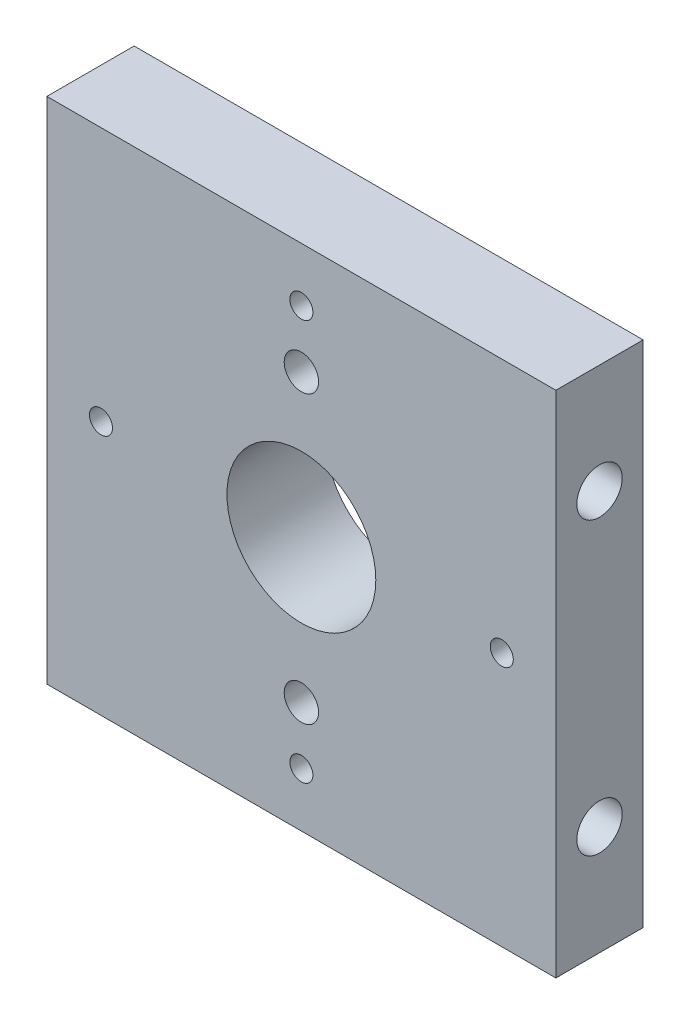
ISO-10303-21;
HEADER;
FILE_DESCRIPTION(('STEP AP214'),'2;1');
FILE_NAME('part.step','',(''),(''),'','','');
FILE_SCHEMA(('AUTOMOTIVE_DESIGN { 1 0 10303 214 1 1 1 1 }'));
ENDSEC;
DATA;
#1=APPLICATION_CONTEXT('core data for automotive mechanical design processes');
#2=APPLICATION_PROTOCOL_DEFINITION('international standard','automotive_design',2000,#1);
#3=PRODUCT_CONTEXT('',#1,'mechanical');
#4=PRODUCT('Part','Part','',(#3));
#5=PRODUCT_RELATED_PRODUCT_CATEGORY('part','',(#4));
#6=PRODUCT_DEFINITION_FORMATION('','',#4);
#7=PRODUCT_DEFINITION_CONTEXT('part definition',#1,'design');
#8=PRODUCT_DEFINITION('design','',#6,#7);
#9=PRODUCT_DEFINITION_SHAPE('','',#8);
#10=(LENGTH_UNIT() NAMED_UNIT(*) SI_UNIT(.MILLI.,.METRE.));
#11=(NAMED_UNIT(*) PLANE_ANGLE_UNIT() SI_UNIT($,.RADIAN.));
#12=(NAMED_UNIT(*) SI_UNIT($,.STERADIAN.) SOLID_ANGLE_UNIT());
#13=UNCERTAINTY_MEASURE_WITH_UNIT(LENGTH_MEASURE(1.E-05),#10,'distance_accuracy_value','');
#14=(GEOMETRIC_REPRESENTATION_CONTEXT(3) GLOBAL_UNCERTAINTY_ASSIGNED_CONTEXT((#13)) GLOBAL_UNIT_ASSIGNED_CONTEXT((#10,
#11,#12)) REPRESENTATION_CONTEXT('',''));
#15=CARTESIAN_POINT('',(0.,0.,0.));
#16=DIRECTION('',(0.,0.,1.));
#17=DIRECTION('',(1.,0.,0.));
#18=AXIS2_PLACEMENT_3D('',#15,#16,#17);
#19=CARTESIAN_POINT('',(12.2250000011377,12.7,0.));
#20=DIRECTION('',(1.,0.,0.));
#21=DIRECTION('',(0.,1.,0.));
#22=AXIS2_PLACEMENT_3D('',#19,#20,#21);
#23=CONICAL_SURFACE('',#22,1.98099999926171,1.02974425747177);
#24=CARTESIAN_POINT('',(11.0346951121016,12.7,-5.6843418860808E-11));
#25=VERTEX_POINT('',#24);
#26=VERTEX_LOOP('',#25);
#27=FACE_BOUND('',#26,.T.);
#28=CARTESIAN_POINT('',(12.225,12.7,0.));
#29=DIRECTION('',(-1.,0.,0.));
#30=DIRECTION('',(0.,0.,1.));
#31=AXIS2_PLACEMENT_3D('',#28,#29,#30);
#32=CIRCLE('',#31,1.981);
#33=CARTESIAN_POINT('',(12.225,12.7,1.981));
#34=VERTEX_POINT('',#33);
#35=EDGE_CURVE('E149',#34,#34,#32,.F.);
#36=ORIENTED_EDGE('',*,*,#35,.T.);
#37=EDGE_LOOP('',(#36));
#38=FACE_BOUND('',#37,.T.);
#39=ADVANCED_FACE('F17',(#27,#38),#23,.F.);
#40=CARTESIAN_POINT('',(12.225,-12.7,0.));
#41=DIRECTION('',(1.,0.,0.));
#42=DIRECTION('',(0.,1.,0.));
#43=AXIS2_PLACEMENT_3D('',#40,#41,#42);
#44=CONICAL_SURFACE('',#43,1.981,1.02974425867666);
#45=CARTESIAN_POINT('',(11.0346951137064,-12.7,0.));
#46=VERTEX_POINT('',#45);
#47=VERTEX_LOOP('',#46);
#48=FACE_BOUND('',#47,.T.);
#49=CARTESIAN_POINT('',(12.225,-12.7,0.));
#50=DIRECTION('',(1.,0.,0.));
#51=DIRECTION('',(0.,1.,0.));
#52=AXIS2_PLACEMENT_3D('',#49,#50,#51);
#53=CIRCLE('',#52,1.981);
#54=CARTESIAN_POINT('',(12.225,-10.719,0.));
#55=VERTEX_POINT('',#54);
#56=EDGE_CURVE('E146',#55,#55,#53,.T.);
#57=ORIENTED_EDGE('',*,*,#56,.T.);
#58=EDGE_LOOP('',(#57));
#59=FACE_BOUND('',#58,.T.);
#60=ADVANCED_FACE('F326',(#48,#59),#44,.F.);
#61=CARTESIAN_POINT('',(-12.225,12.7,0.));
#62=DIRECTION('',(-1.,0.,0.));
#63=DIRECTION('',(0.,-1.,0.));
#64=AXIS2_PLACEMENT_3D('',#61,#62,#63);
#65=CONICAL_SURFACE('',#64,1.981,1.02974425867666);
#66=CARTESIAN_POINT('',(-11.0346951137064,12.7,0.));
#67=VERTEX_POINT('',#66);
#68=VERTEX_LOOP('',#67);
#69=FACE_BOUND('',#68,.T.);
#70=CARTESIAN_POINT('',(-12.225,12.7,0.));
#71=DIRECTION('',(-1.,0.,0.));
#72=DIRECTION('',(0.,-1.,0.));
#73=AXIS2_PLACEMENT_3D('',#70,#71,#72);
#74=CIRCLE('',#73,1.981);
#75=CARTESIAN_POINT('',(-12.225,10.719,0.));
#76=VERTEX_POINT('',#75);
#77=EDGE_CURVE('E143',#76,#76,#74,.T.);
#78=ORIENTED_EDGE('',*,*,#77,.T.);
#79=EDGE_LOOP('',(#78));
#80=FACE_BOUND('',#79,.T.);
#81=ADVANCED_FACE('F322',(#69,#80),#65,.F.);
#82=CARTESIAN_POINT('',(-12.2250000011377,-12.7,0.));
#83=DIRECTION('',(-1.,0.,0.));
#84=DIRECTION('',(0.,-1.,0.));
#85=AXIS2_PLACEMENT_3D('',#82,#83,#84);
#86=CONICAL_SURFACE('',#85,1.98099999926171,1.02974425747177);
#87=CARTESIAN_POINT('',(-11.0346951121016,-12.7,-5.6843418860808E-11));
#88=VERTEX_POINT('',#87);
#89=VERTEX_LOOP('',#88);
#90=FACE_BOUND('',#89,.T.);
#91=CARTESIAN_POINT('',(-12.225,-12.7,0.));
#92=DIRECTION('',(1.,0.,0.));
#93=DIRECTION('',(0.,0.,-1.));
#94=AXIS2_PLACEMENT_3D('',#91,#92,#93);
#95=CIRCLE('',#94,1.981);
#96=CARTESIAN_POINT('',(-12.225,-12.7,-1.981));
#97=VERTEX_POINT('',#96);
#98=EDGE_CURVE('E106',#97,#97,#95,.F.);
#99=ORIENTED_EDGE('',*,*,#98,.T.);
#100=EDGE_LOOP('',(#99));
#101=FACE_BOUND('',#100,.T.);
#102=ADVANCED_FACE('F325',(#90,#101),#86,.F.);
#103=CARTESIAN_POINT('',(0.,0.,-3.81));
#104=DIRECTION('',(0.,0.,-1.));
#105=DIRECTION('',(-1.,0.,0.));
#106=AXIS2_PLACEMENT_3D('',#103,#104,#105);
#107=CYLINDRICAL_SURFACE('',#106,15.);
#108=DIRECTION('',(0.,0.,1.));
#109=VECTOR('',#108,1.);
#110=CARTESIAN_POINT('',(-1.11636438495681,-14.9584,-2.05999999999999));
#111=LINE('',#110,#109);
#112=CARTESIAN_POINT('',(-1.11636438495682,-14.9584,-4.80999999999998));
#113=VERTEX_POINT('',#112);
#114=CARTESIAN_POINT('',(-1.11636438495683,-14.9584,-3.80999999999997));
#115=VERTEX_POINT('',#114);
#116=EDGE_CURVE('E132',#113,#115,#111,.T.);
#117=ORIENTED_EDGE('',*,*,#116,.T.);
#118=CARTESIAN_POINT('',(0.,0.,-3.81));
#119=DIRECTION('',(0.,0.,-1.));
#120=DIRECTION('',(-1.,0.,0.));
#121=AXIS2_PLACEMENT_3D('',#118,#119,#120);
#122=CIRCLE('',#121,15.);
#123=CARTESIAN_POINT('',(-1.11636438495686,14.9584,-3.80999999999998));
#124=VERTEX_POINT('',#123);
#125=EDGE_CURVE('E120',#115,#124,#122,.T.);
#126=ORIENTED_EDGE('',*,*,#125,.T.);
#127=DIRECTION('',(0.,0.,-1.));
#128=VECTOR('',#127,1.);
#129=CARTESIAN_POINT('',(-1.11636438495683,14.9584,-2.05999999999999));
#130=LINE('',#129,#128);
#131=CARTESIAN_POINT('',(-1.11636438495683,14.9584,-4.80999999999998));
#132=VERTEX_POINT('',#131);
#133=EDGE_CURVE('E114',#124,#132,#130,.T.);
#134=ORIENTED_EDGE('',*,*,#133,.T.);
#135=CARTESIAN_POINT('',(0.,0.,-4.80999999999999));
#136=DIRECTION('',(0.,0.,-1.));
#137=DIRECTION('',(-1.,0.,0.));
#138=AXIS2_PLACEMENT_3D('',#135,#136,#137);
#139=CIRCLE('',#138,15.);
#140=EDGE_CURVE('E127',#132,#113,#139,.F.);
#141=ORIENTED_EDGE('',*,*,#140,.T.);
#142=EDGE_LOOP('',(#117,#126,#134,#141));
#143=FACE_BOUND('',#142,.T.);
#144=ADVANCED_FACE('F206',(#143),#107,.T.);
#145=CARTESIAN_POINT('',(0.,-12.5,-4.80999999999996));
#146=DIRECTION('',(0.,0.,1.));
#147=DIRECTION('',(1.,0.,0.));
#148=AXIS2_PLACEMENT_3D('',#145,#146,#147);
#149=CYLINDRICAL_SURFACE('',#148,2.69999999999999);
#150=CARTESIAN_POINT('',(0.,-12.5,0.690000000000008));
#151=DIRECTION('',(0.,0.,1.));
#152=DIRECTION('',(1.,0.,0.));
#153=AXIS2_PLACEMENT_3D('',#150,#151,#152);
#154=CIRCLE('',#153,2.69999999999999);
#155=CARTESIAN_POINT('',(2.69999999999999,-12.5,0.690000000000009));
#156=VERTEX_POINT('',#155);
#157=EDGE_CURVE('E123',#156,#156,#154,.T.);
#158=ORIENTED_EDGE('',*,*,#157,.T.);
#159=EDGE_LOOP('',(#158));
#160=FACE_BOUND('',#159,.T.);
#161=ORIENTED_EDGE('',*,*,#116,.F.);
#162=CARTESIAN_POINT('',(0.,-12.5,-4.80999999999996));
#163=DIRECTION('',(0.,0.,1.));
#164=DIRECTION('',(1.,0.,0.));
#165=AXIS2_PLACEMENT_3D('',#162,#163,#164);
#166=CIRCLE('',#165,2.69999999999999);
#167=CARTESIAN_POINT('',(1.11636438495684,-14.9584,-4.80999999999998));
#168=VERTEX_POINT('',#167);
#169=EDGE_CURVE('E133',#113,#168,#166,.F.);
#170=ORIENTED_EDGE('',*,*,#169,.T.);
#171=DIRECTION('',(0.,0.,-1.));
#172=VECTOR('',#171,1.);
#173=CARTESIAN_POINT('',(1.11636438495684,-14.9584,-3.81));
#174=LINE('',#173,#172);
#175=CARTESIAN_POINT('',(1.11636438495686,-14.9584,-3.80999999999998));
#176=VERTEX_POINT('',#175);
#177=EDGE_CURVE('E93',#176,#168,#174,.T.);
#178=ORIENTED_EDGE('',*,*,#177,.F.);
#179=CARTESIAN_POINT('',(0.,-12.5,-3.80999999999997));
#180=DIRECTION('',(0.,0.,1.));
#181=DIRECTION('',(1.,0.,0.));
#182=AXIS2_PLACEMENT_3D('',#179,#180,#181);
#183=CIRCLE('',#182,2.69999999999999);
#184=EDGE_CURVE('E104',#176,#115,#183,.F.);
#185=ORIENTED_EDGE('',*,*,#184,.T.);
#186=EDGE_LOOP('',(#161,#170,#178,#185));
#187=FACE_BOUND('',#186,.T.);
#188=ADVANCED_FACE('F130',(#160,#187),#149,.F.);
#189=CARTESIAN_POINT('',(0.,0.,-3.81));
#190=DIRECTION('',(0.,0.,-1.));
#191=DIRECTION('',(-1.,0.,0.));
#192=AXIS2_PLACEMENT_3D('',#189,#190,#191);
#193=CYLINDRICAL_SURFACE('',#192,15.);
#194=DIRECTION('',(0.,0.,1.));
#195=VECTOR('',#194,1.);
#196=CARTESIAN_POINT('',(1.11636438495681,14.9584,-2.05999999999999));
#197=LINE('',#196,#195);
#198=CARTESIAN_POINT('',(1.11636438495682,14.9584,-4.80999999999998));
#199=VERTEX_POINT('',#198);
#200=CARTESIAN_POINT('',(1.11636438495683,14.9584,-3.80999999999997));
#201=VERTEX_POINT('',#200);
#202=EDGE_CURVE('E109',#199,#201,#197,.T.);
#203=ORIENTED_EDGE('',*,*,#202,.T.);
#204=CARTESIAN_POINT('',(0.,0.,-3.81));
#205=DIRECTION('',(0.,0.,-1.));
#206=DIRECTION('',(-1.,0.,0.));
#207=AXIS2_PLACEMENT_3D('',#204,#205,#206);
#208=CIRCLE('',#207,15.);
#209=EDGE_CURVE('E21',#201,#176,#208,.T.);
#210=ORIENTED_EDGE('',*,*,#209,.T.);
#211=ORIENTED_EDGE('',*,*,#177,.T.);
#212=CARTESIAN_POINT('',(0.,0.,-4.80999999999999));
#213=DIRECTION('',(0.,0.,-1.));
#214=DIRECTION('',(-1.,0.,0.));
#215=AXIS2_PLACEMENT_3D('',#212,#213,#214);
#216=CIRCLE('',#215,15.);
#217=EDGE_CURVE('E111',#168,#199,#216,.F.);
#218=ORIENTED_EDGE('',*,*,#217,.T.);
#219=EDGE_LOOP('',(#203,#210,#211,#218));
#220=FACE_BOUND('',#219,.T.);
#221=ADVANCED_FACE('F110',(#220),#193,.T.);
#222=CARTESIAN_POINT('',(0.,12.5,-4.80999999999996));
#223=DIRECTION('',(0.,0.,1.));
#224=DIRECTION('',(1.,0.,0.));
#225=AXIS2_PLACEMENT_3D('',#222,#223,#224);
#226=CYLINDRICAL_SURFACE('',#225,2.69999999999999);
#227=CARTESIAN_POINT('',(0.,12.5,0.690000000000008));
#228=DIRECTION('',(0.,0.,1.));
#229=DIRECTION('',(1.,0.,0.));
#230=AXIS2_PLACEMENT_3D('',#227,#228,#229);
#231=CIRCLE('',#230,2.69999999999999);
#232=CARTESIAN_POINT('',(2.69999999999999,12.5,0.690000000000008));
#233=VERTEX_POINT('',#232);
#234=EDGE_CURVE('E119',#233,#233,#231,.T.);
#235=ORIENTED_EDGE('',*,*,#234,.T.);
#236=EDGE_LOOP('',(#235));
#237=FACE_BOUND('',#236,.T.);
#238=ORIENTED_EDGE('',*,*,#202,.F.);
#239=CARTESIAN_POINT('',(0.,12.5,-4.80999999999996));
#240=DIRECTION('',(0.,0.,1.));
#241=DIRECTION('',(1.,0.,0.));
#242=AXIS2_PLACEMENT_3D('',#239,#240,#241);
#243=CIRCLE('',#242,2.69999999999999);
#244=EDGE_CURVE('E204',#199,#132,#243,.F.);
#245=ORIENTED_EDGE('',*,*,#244,.T.);
#246=ORIENTED_EDGE('',*,*,#133,.F.);
#247=CARTESIAN_POINT('',(0.,12.5,-3.80999999999997));
#248=DIRECTION('',(0.,0.,1.));
#249=DIRECTION('',(1.,0.,0.));
#250=AXIS2_PLACEMENT_3D('',#247,#248,#249);
#251=CIRCLE('',#250,2.69999999999999);
#252=EDGE_CURVE('E103',#124,#201,#251,.F.);
#253=ORIENTED_EDGE('',*,*,#252,.T.);
#254=EDGE_LOOP('',(#238,#245,#246,#253));
#255=FACE_BOUND('',#254,.T.);
#256=ADVANCED_FACE('F117',(#237,#255),#226,.F.);
#257=CARTESIAN_POINT('',(17.225,12.7,0.));
#258=DIRECTION('',(-1.,0.,0.));
#259=DIRECTION('',(0.,0.,1.));
#260=AXIS2_PLACEMENT_3D('',#257,#258,#259);
#261=CYLINDRICAL_SURFACE('',#260,1.981);
#262=CARTESIAN_POINT('',(22.225,12.7,0.));
#263=DIRECTION('',(-1.,0.,0.));
#264=DIRECTION('',(0.,0.,1.));
#265=AXIS2_PLACEMENT_3D('',#262,#263,#264);
#266=CIRCLE('',#265,1.981);
#267=CARTESIAN_POINT('',(22.225,12.7,1.981));
#268=VERTEX_POINT('',#267);
#269=EDGE_CURVE('E200',#268,#268,#266,.T.);
#270=ORIENTED_EDGE('',*,*,#269,.F.);
#271=EDGE_LOOP('',(#270));
#272=FACE_BOUND('',#271,.T.);
#273=ORIENTED_EDGE('',*,*,#35,.F.);
#274=EDGE_LOOP('',(#273));
#275=FACE_BOUND('',#274,.T.);
#276=ADVANCED_FACE('F314',(#272,#275),#261,.F.);
#277=CARTESIAN_POINT('',(22.225,-12.7,0.));
#278=DIRECTION('',(-1.,0.,0.));
#279=DIRECTION('',(0.,0.,1.));
#280=AXIS2_PLACEMENT_3D('',#277,#278,#279);
#281=CYLINDRICAL_SURFACE('',#280,1.981);
#282=CARTESIAN_POINT('',(22.225,-12.7,0.));
#283=DIRECTION('',(-1.,0.,0.));
#284=DIRECTION('',(0.,0.,1.));
#285=AXIS2_PLACEMENT_3D('',#282,#283,#284);
#286=CIRCLE('',#285,1.981);
#287=CARTESIAN_POINT('',(22.225,-12.7,1.981));
#288=VERTEX_POINT('',#287);
#289=EDGE_CURVE('E196',#288,#288,#286,.T.);
#290=ORIENTED_EDGE('',*,*,#289,.F.);
#291=EDGE_LOOP('',(#290));
#292=FACE_BOUND('',#291,.T.);
#293=ORIENTED_EDGE('',*,*,#56,.F.);
#294=EDGE_LOOP('',(#293));
#295=FACE_BOUND('',#294,.T.);
#296=ADVANCED_FACE('F310',(#292,#295),#281,.F.);
#297=CARTESIAN_POINT('',(-22.225,12.7,0.));
#298=DIRECTION('',(1.,0.,0.));
#299=DIRECTION('',(0.,0.,-1.));
#300=AXIS2_PLACEMENT_3D('',#297,#298,#299);
#301=CYLINDRICAL_SURFACE('',#300,1.981);
#302=CARTESIAN_POINT('',(-22.225,12.7,0.));
#303=DIRECTION('',(1.,0.,0.));
#304=DIRECTION('',(0.,0.,-1.));
#305=AXIS2_PLACEMENT_3D('',#302,#303,#304);
#306=CIRCLE('',#305,1.981);
#307=CARTESIAN_POINT('',(-22.225,12.7,-1.981));
#308=VERTEX_POINT('',#307);
#309=EDGE_CURVE('E192',#308,#308,#306,.T.);
#310=ORIENTED_EDGE('',*,*,#309,.F.);
#311=EDGE_LOOP('',(#310));
#312=FACE_BOUND('',#311,.T.);
#313=ORIENTED_EDGE('',*,*,#77,.F.);
#314=EDGE_LOOP('',(#313));
#315=FACE_BOUND('',#314,.T.);
#316=ADVANCED_FACE('F306',(#312,#315),#301,.F.);
#317=CARTESIAN_POINT('',(-17.225,-12.7,0.));
#318=DIRECTION('',(1.,0.,0.));
#319=DIRECTION('',(0.,0.,-1.));
#320=AXIS2_PLACEMENT_3D('',#317,#318,#319);
#321=CYLINDRICAL_SURFACE('',#320,1.981);
#322=CARTESIAN_POINT('',(-22.225,-12.7,0.));
#323=DIRECTION('',(1.,0.,0.));
#324=DIRECTION('',(0.,0.,-1.));
#325=AXIS2_PLACEMENT_3D('',#322,#323,#324);
#326=CIRCLE('',#325,1.981);
#327=CARTESIAN_POINT('',(-22.225,-12.7,-1.981));
#328=VERTEX_POINT('',#327);
#329=EDGE_CURVE('E189',#328,#328,#326,.T.);
#330=ORIENTED_EDGE('',*,*,#329,.F.);
#331=EDGE_LOOP('',(#330));
#332=FACE_BOUND('',#331,.T.);
#333=ORIENTED_EDGE('',*,*,#98,.F.);
#334=EDGE_LOOP('',(#333));
#335=FACE_BOUND('',#334,.T.);
#336=ADVANCED_FACE('F309',(#332,#335),#321,.F.);
#337=CARTESIAN_POINT('',(0.,0.,-3.81));
#338=DIRECTION('',(0.,0.,1.));
#339=DIRECTION('',(1.,0.,0.));
#340=AXIS2_PLACEMENT_3D('',#337,#338,#339);
#341=PLANE('',#340);
#342=ORIENTED_EDGE('',*,*,#125,.F.);
#343=ORIENTED_EDGE('',*,*,#184,.F.);
#344=ORIENTED_EDGE('',*,*,#209,.F.);
#345=ORIENTED_EDGE('',*,*,#252,.F.);
#346=EDGE_LOOP('',(#342,#343,#344,#345));
#347=FACE_BOUND('',#346,.T.);
#348=CARTESIAN_POINT('',(0.,17.5,-3.81));
#349=DIRECTION('',(0.,0.,1.));
#350=DIRECTION('',(1.,0.,0.));
#351=AXIS2_PLACEMENT_3D('',#348,#349,#350);
#352=CIRCLE('',#351,1.00650000000002);
#353=CARTESIAN_POINT('',(1.00650000000002,17.5,-3.81));
#354=VERTEX_POINT('',#353);
#355=EDGE_CURVE('E175',#354,#354,#352,.T.);
#356=ORIENTED_EDGE('',*,*,#355,.T.);
#357=EDGE_LOOP('',(#356));
#358=FACE_BOUND('',#357,.T.);
#359=CARTESIAN_POINT('',(-17.5,0.,-3.81));
#360=DIRECTION('',(0.,0.,1.));
#361=DIRECTION('',(1.,0.,0.));
#362=AXIS2_PLACEMENT_3D('',#359,#360,#361);
#363=CIRCLE('',#362,1.0065);
#364=CARTESIAN_POINT('',(-16.4935,0.,-3.81));
#365=VERTEX_POINT('',#364);
#366=EDGE_CURVE('E179',#365,#365,#363,.T.);
#367=ORIENTED_EDGE('',*,*,#366,.T.);
#368=EDGE_LOOP('',(#367));
#369=FACE_BOUND('',#368,.T.);
#370=CARTESIAN_POINT('',(17.5,0.,-3.81));
#371=DIRECTION('',(0.,0.,1.));
#372=DIRECTION('',(1.,0.,0.));
#373=AXIS2_PLACEMENT_3D('',#370,#371,#372);
#374=CIRCLE('',#373,1.0065);
#375=CARTESIAN_POINT('',(18.5065,0.,-3.81));
#376=VERTEX_POINT('',#375);
#377=EDGE_CURVE('E182',#376,#376,#374,.T.);
#378=ORIENTED_EDGE('',*,*,#377,.T.);
#379=EDGE_LOOP('',(#378));
#380=FACE_BOUND('',#379,.T.);
#381=CARTESIAN_POINT('',(0.,-17.5,-3.81));
#382=DIRECTION('',(0.,0.,1.));
#383=DIRECTION('',(1.,0.,0.));
#384=AXIS2_PLACEMENT_3D('',#381,#382,#383);
#385=CIRCLE('',#384,1.0065);
#386=CARTESIAN_POINT('',(1.0065,-17.5,-3.81));
#387=VERTEX_POINT('',#386);
#388=EDGE_CURVE('E185',#387,#387,#385,.T.);
#389=ORIENTED_EDGE('',*,*,#388,.T.);
#390=EDGE_LOOP('',(#389));
#391=FACE_BOUND('',#390,.T.);
#392=DIRECTION('',(1.,0.,0.));
#393=VECTOR('',#392,1.);
#394=CARTESIAN_POINT('',(-22.225,22.225,-3.81));
#395=LINE('',#394,#393);
#396=CARTESIAN_POINT('',(22.225,22.225,-3.81));
#397=VERTEX_POINT('',#396);
#398=CARTESIAN_POINT('',(-22.225,22.225,-3.81));
#399=VERTEX_POINT('',#398);
#400=EDGE_CURVE('E252',#397,#399,#395,.F.);
#401=ORIENTED_EDGE('',*,*,#400,.F.);
#402=DIRECTION('',(0.,1.,0.));
#403=VECTOR('',#402,1.);
#404=CARTESIAN_POINT('',(22.225,22.225,-3.81));
#405=LINE('',#404,#403);
#406=CARTESIAN_POINT('',(22.225,-22.225,-3.81));
#407=VERTEX_POINT('',#406);
#408=EDGE_CURVE('E203',#407,#397,#405,.T.);
#409=ORIENTED_EDGE('',*,*,#408,.F.);
#410=DIRECTION('',(1.,0.,0.));
#411=VECTOR('',#410,1.);
#412=CARTESIAN_POINT('',(22.225,-22.225,-3.81));
#413=LINE('',#412,#411);
#414=CARTESIAN_POINT('',(-22.225,-22.225,-3.81));
#415=VERTEX_POINT('',#414);
#416=EDGE_CURVE('E261',#415,#407,#413,.T.);
#417=ORIENTED_EDGE('',*,*,#416,.F.);
#418=DIRECTION('',(0.,1.,0.));
#419=VECTOR('',#418,1.);
#420=CARTESIAN_POINT('',(-22.225,-22.225,-3.81));
#421=LINE('',#420,#419);
#422=EDGE_CURVE('E195',#399,#415,#421,.F.);
#423=ORIENTED_EDGE('',*,*,#422,.F.);
#424=EDGE_LOOP('',(#401,#409,#417,#423));
#425=FACE_BOUND('',#424,.T.);
#426=ADVANCED_FACE('F100',(#347,#358,#369,#380,#391,#425),#341,.F.);
#427=CARTESIAN_POINT('',(0.,12.5,0.690000000000008));
#428=DIRECTION('',(0.,0.,-1.));
#429=DIRECTION('',(-1.,0.,0.));
#430=AXIS2_PLACEMENT_3D('',#427,#428,#429);
#431=CONICAL_SURFACE('',#430,2.69999999999999,1.02974425867666);
#432=ORIENTED_EDGE('',*,*,#234,.F.);
#433=EDGE_LOOP('',(#432));
#434=FACE_BOUND('',#433,.T.);
#435=CARTESIAN_POINT('',(0.,12.5,1.41103274283306));
#436=DIRECTION('',(0.,0.,1.));
#437=DIRECTION('',(0.,-1.,0.));
#438=AXIS2_PLACEMENT_3D('',#435,#436,#437);
#439=CIRCLE('',#438,1.5);
#440=CARTESIAN_POINT('',(0.,11.,1.41103274283306));
#441=VERTEX_POINT('',#440);
#442=EDGE_CURVE('E178',#441,#441,#439,.T.);
#443=ORIENTED_EDGE('',*,*,#442,.T.);
#444=EDGE_LOOP('',(#443));
#445=FACE_BOUND('',#444,.T.);
#446=ADVANCED_FACE('F222',(#434,#445),#431,.F.);
#447=CARTESIAN_POINT('',(0.,-12.5,0.690000000000008));
#448=DIRECTION('',(0.,0.,-1.));
#449=DIRECTION('',(-1.,0.,0.));
#450=AXIS2_PLACEMENT_3D('',#447,#448,#449);
#451=CONICAL_SURFACE('',#450,2.69999999999999,1.02974425867667);
#452=ORIENTED_EDGE('',*,*,#157,.F.);
#453=EDGE_LOOP('',(#452));
#454=FACE_BOUND('',#453,.T.);
#455=CARTESIAN_POINT('',(0.,-12.5,1.41103274283306));
#456=DIRECTION('',(0.,0.,1.));
#457=DIRECTION('',(0.,-1.,0.));
#458=AXIS2_PLACEMENT_3D('',#455,#456,#457);
#459=CIRCLE('',#458,1.5);
#460=CARTESIAN_POINT('',(0.,-14.,1.41103274283306));
#461=VERTEX_POINT('',#460);
#462=EDGE_CURVE('E174',#461,#461,#459,.T.);
#463=ORIENTED_EDGE('',*,*,#462,.T.);
#464=EDGE_LOOP('',(#463));
#465=FACE_BOUND('',#464,.T.);
#466=ADVANCED_FACE('F211',(#454,#465),#451,.F.);
#467=CARTESIAN_POINT('',(0.,0.,-4.80999999999999));
#468=DIRECTION('',(0.,0.,1.));
#469=DIRECTION('',(1.,0.,0.));
#470=AXIS2_PLACEMENT_3D('',#467,#468,#469);
#471=PLANE('',#470);
#472=CARTESIAN_POINT('',(0.,0.,-4.80999999999999));
#473=DIRECTION('',(0.,0.,1.));
#474=DIRECTION('',(1.,0.,0.));
#475=AXIS2_PLACEMENT_3D('',#472,#473,#474);
#476=CIRCLE('',#475,6.50000000000001);
#477=CARTESIAN_POINT('',(6.50000000000001,0.,-4.80999999999999));
#478=VERTEX_POINT('',#477);
#479=EDGE_CURVE('E170',#478,#478,#476,.T.);
#480=ORIENTED_EDGE('',*,*,#479,.T.);
#481=EDGE_LOOP('',(#480));
#482=FACE_BOUND('',#481,.T.);
#483=ORIENTED_EDGE('',*,*,#244,.F.);
#484=ORIENTED_EDGE('',*,*,#217,.F.);
#485=ORIENTED_EDGE('',*,*,#169,.F.);
#486=ORIENTED_EDGE('',*,*,#140,.F.);
#487=EDGE_LOOP('',(#483,#484,#485,#486));
#488=FACE_BOUND('',#487,.T.);
#489=ADVANCED_FACE('F208',(#482,#488),#471,.F.);
#490=CARTESIAN_POINT('',(22.225,22.225,0.));
#491=DIRECTION('',(1.,0.,0.));
#492=DIRECTION('',(0.,0.,-1.));
#493=AXIS2_PLACEMENT_3D('',#490,#491,#492);
#494=PLANE('',#493);
#495=ORIENTED_EDGE('',*,*,#289,.T.);
#496=EDGE_LOOP('',(#495));
#497=FACE_BOUND('',#496,.T.);
#498=ORIENTED_EDGE('',*,*,#269,.T.);
#499=EDGE_LOOP('',(#498));
#500=FACE_BOUND('',#499,.T.);
#501=ORIENTED_EDGE('',*,*,#408,.T.);
#502=DIRECTION('',(0.,0.,1.));
#503=VECTOR('',#502,1.);
#504=CARTESIAN_POINT('',(22.225,22.225,0.));
#505=LINE('',#504,#503);
#506=CARTESIAN_POINT('',(22.225,22.225,3.81));
#507=VERTEX_POINT('',#506);
#508=EDGE_CURVE('E199',#507,#397,#505,.F.);
#509=ORIENTED_EDGE('',*,*,#508,.F.);
#510=DIRECTION('',(0.,1.,0.));
#511=VECTOR('',#510,1.);
#512=CARTESIAN_POINT('',(22.225,0.,3.81));
#513=LINE('',#512,#511);
#514=CARTESIAN_POINT('',(22.225,-22.225,3.81));
#515=VERTEX_POINT('',#514);
#516=EDGE_CURVE('E173',#515,#507,#513,.T.);
#517=ORIENTED_EDGE('',*,*,#516,.F.);
#518=DIRECTION('',(0.,0.,-1.));
#519=VECTOR('',#518,1.);
#520=CARTESIAN_POINT('',(22.225,-22.225,0.));
#521=LINE('',#520,#519);
#522=EDGE_CURVE('E188',#407,#515,#521,.F.);
#523=ORIENTED_EDGE('',*,*,#522,.F.);
#524=EDGE_LOOP('',(#501,#509,#517,#523));
#525=FACE_BOUND('',#524,.T.);
#526=ADVANCED_FACE('F210',(#497,#500,#525),#494,.T.);
#527=CARTESIAN_POINT('',(-22.225,22.225,0.));
#528=DIRECTION('',(0.,1.,0.));
#529=DIRECTION('',(0.,0.,1.));
#530=AXIS2_PLACEMENT_3D('',#527,#528,#529);
#531=PLANE('',#530);
#532=ORIENTED_EDGE('',*,*,#400,.T.);
#533=DIRECTION('',(0.,0.,1.));
#534=VECTOR('',#533,1.);
#535=CARTESIAN_POINT('',(-22.225,22.225,0.));
#536=LINE('',#535,#534);
#537=CARTESIAN_POINT('',(-22.225,22.225,3.81));
#538=VERTEX_POINT('',#537);
#539=EDGE_CURVE('E256',#538,#399,#536,.F.);
#540=ORIENTED_EDGE('',*,*,#539,.F.);
#541=DIRECTION('',(1.,0.,0.));
#542=VECTOR('',#541,1.);
#543=CARTESIAN_POINT('',(0.,22.225,3.81));
#544=LINE('',#543,#542);
#545=EDGE_CURVE('E537',#507,#538,#544,.F.);
#546=ORIENTED_EDGE('',*,*,#545,.F.);
#547=ORIENTED_EDGE('',*,*,#508,.T.);
#548=EDGE_LOOP('',(#532,#540,#546,#547));
#549=FACE_BOUND('',#548,.T.);
#550=ADVANCED_FACE('F219',(#549),#531,.T.);
#551=CARTESIAN_POINT('',(-22.225,-22.225,0.));
#552=DIRECTION('',(-1.,0.,0.));
#553=DIRECTION('',(0.,0.,1.));
#554=AXIS2_PLACEMENT_3D('',#551,#552,#553);
#555=PLANE('',#554);
#556=ORIENTED_EDGE('',*,*,#329,.T.);
#557=EDGE_LOOP('',(#556));
#558=FACE_BOUND('',#557,.T.);
#559=ORIENTED_EDGE('',*,*,#309,.T.);
#560=EDGE_LOOP('',(#559));
#561=FACE_BOUND('',#560,.T.);
#562=ORIENTED_EDGE('',*,*,#422,.T.);
#563=DIRECTION('',(0.,0.,-1.));
#564=VECTOR('',#563,1.);
#565=CARTESIAN_POINT('',(-22.225,-22.225,0.));
#566=LINE('',#565,#564);
#567=CARTESIAN_POINT('',(-22.225,-22.225,3.81));
#568=VERTEX_POINT('',#567);
#569=EDGE_CURVE('E36',#568,#415,#566,.T.);
#570=ORIENTED_EDGE('',*,*,#569,.F.);
#571=DIRECTION('',(0.,1.,0.));
#572=VECTOR('',#571,1.);
#573=CARTESIAN_POINT('',(-22.225,0.,3.81));
#574=LINE('',#573,#572);
#575=EDGE_CURVE('E264',#538,#568,#574,.F.);
#576=ORIENTED_EDGE('',*,*,#575,.F.);
#577=ORIENTED_EDGE('',*,*,#539,.T.);
#578=EDGE_LOOP('',(#562,#570,#576,#577));
#579=FACE_BOUND('',#578,.T.);
#580=ADVANCED_FACE('F241',(#558,#561,#579),#555,.T.);
#581=CARTESIAN_POINT('',(22.225,-22.225,0.));
#582=DIRECTION('',(0.,-1.,0.));
#583=DIRECTION('',(0.,0.,-1.));
#584=AXIS2_PLACEMENT_3D('',#581,#582,#583);
#585=PLANE('',#584);
#586=ORIENTED_EDGE('',*,*,#416,.T.);
#587=ORIENTED_EDGE('',*,*,#522,.T.);
#588=DIRECTION('',(1.,0.,0.));
#589=VECTOR('',#588,1.);
#590=CARTESIAN_POINT('',(0.,-22.225,3.81));
#591=LINE('',#590,#589);
#592=EDGE_CURVE('E169',#568,#515,#591,.T.);
#593=ORIENTED_EDGE('',*,*,#592,.F.);
#594=ORIENTED_EDGE('',*,*,#569,.T.);
#595=EDGE_LOOP('',(#586,#587,#593,#594));
#596=FACE_BOUND('',#595,.T.);
#597=ADVANCED_FACE('F237',(#596),#585,.T.);
#598=CARTESIAN_POINT('',(0.,-17.5,-3.81));
#599=DIRECTION('',(0.,0.,1.));
#600=DIRECTION('',(1.,0.,0.));
#601=AXIS2_PLACEMENT_3D('',#598,#599,#600);
#602=CYLINDRICAL_SURFACE('',#601,1.0065);
#603=ORIENTED_EDGE('',*,*,#388,.F.);
#604=EDGE_LOOP('',(#603));
#605=FACE_BOUND('',#604,.T.);
#606=CARTESIAN_POINT('',(0.,-17.5,3.81));
#607=DIRECTION('',(0.,0.,1.));
#608=DIRECTION('',(1.,0.,0.));
#609=AXIS2_PLACEMENT_3D('',#606,#607,#608);
#610=CIRCLE('',#609,1.0065);
#611=CARTESIAN_POINT('',(1.0065,-17.5,3.81));
#612=VERTEX_POINT('',#611);
#613=EDGE_CURVE('E166',#612,#612,#610,.F.);
#614=ORIENTED_EDGE('',*,*,#613,.F.);
#615=EDGE_LOOP('',(#614));
#616=FACE_BOUND('',#615,.T.);
#617=ADVANCED_FACE('F240',(#605,#616),#602,.F.);
#618=CARTESIAN_POINT('',(17.5,0.,-3.81));
#619=DIRECTION('',(0.,0.,1.));
#620=DIRECTION('',(1.,0.,0.));
#621=AXIS2_PLACEMENT_3D('',#618,#619,#620);
#622=CYLINDRICAL_SURFACE('',#621,1.0065);
#623=ORIENTED_EDGE('',*,*,#377,.F.);
#624=EDGE_LOOP('',(#623));
#625=FACE_BOUND('',#624,.T.);
#626=CARTESIAN_POINT('',(17.5,0.,3.81));
#627=DIRECTION('',(0.,0.,1.));
#628=DIRECTION('',(1.,0.,0.));
#629=AXIS2_PLACEMENT_3D('',#626,#627,#628);
#630=CIRCLE('',#629,1.0065);
#631=CARTESIAN_POINT('',(18.5065,0.,3.81));
#632=VERTEX_POINT('',#631);
#633=EDGE_CURVE('E163',#632,#632,#630,.F.);
#634=ORIENTED_EDGE('',*,*,#633,.F.);
#635=EDGE_LOOP('',(#634));
#636=FACE_BOUND('',#635,.T.);
#637=ADVANCED_FACE('F295',(#625,#636),#622,.F.);
#638=CARTESIAN_POINT('',(-17.5,0.,-3.81));
#639=DIRECTION('',(0.,0.,1.));
#640=DIRECTION('',(1.,0.,0.));
#641=AXIS2_PLACEMENT_3D('',#638,#639,#640);
#642=CYLINDRICAL_SURFACE('',#641,1.0065);
#643=ORIENTED_EDGE('',*,*,#366,.F.);
#644=EDGE_LOOP('',(#643));
#645=FACE_BOUND('',#644,.T.);
#646=CARTESIAN_POINT('',(-17.5,0.,3.81));
#647=DIRECTION('',(0.,0.,1.));
#648=DIRECTION('',(1.,0.,0.));
#649=AXIS2_PLACEMENT_3D('',#646,#647,#648);
#650=CIRCLE('',#649,1.0065);
#651=CARTESIAN_POINT('',(-16.4935,0.,3.81));
#652=VERTEX_POINT('',#651);
#653=EDGE_CURVE('E160',#652,#652,#650,.F.);
#654=ORIENTED_EDGE('',*,*,#653,.F.);
#655=EDGE_LOOP('',(#654));
#656=FACE_BOUND('',#655,.T.);
#657=ADVANCED_FACE('F288',(#645,#656),#642,.F.);
#658=CARTESIAN_POINT('',(0.,17.5,-3.81));
#659=DIRECTION('',(0.,0.,1.));
#660=DIRECTION('',(1.,0.,0.));
#661=AXIS2_PLACEMENT_3D('',#658,#659,#660);
#662=CYLINDRICAL_SURFACE('',#661,1.00650000000002);
#663=ORIENTED_EDGE('',*,*,#355,.F.);
#664=EDGE_LOOP('',(#663));
#665=FACE_BOUND('',#664,.T.);
#666=CARTESIAN_POINT('',(0.,17.5,3.81));
#667=DIRECTION('',(0.,0.,1.));
#668=DIRECTION('',(1.,0.,0.));
#669=AXIS2_PLACEMENT_3D('',#666,#667,#668);
#670=CIRCLE('',#669,1.00650000000002);
#671=CARTESIAN_POINT('',(1.00650000000002,17.5,3.81));
#672=VERTEX_POINT('',#671);
#673=EDGE_CURVE('E157',#672,#672,#670,.F.);
#674=ORIENTED_EDGE('',*,*,#673,.F.);
#675=EDGE_LOOP('',(#674));
#676=FACE_BOUND('',#675,.T.);
#677=ADVANCED_FACE('F280',(#665,#676),#662,.F.);
#678=CARTESIAN_POINT('',(0.,12.5,3.81));
#679=DIRECTION('',(0.,0.,-1.));
#680=DIRECTION('',(-1.,0.,0.));
#681=AXIS2_PLACEMENT_3D('',#678,#679,#680);
#682=CYLINDRICAL_SURFACE('',#681,1.5);
#683=CARTESIAN_POINT('',(0.,12.5,3.81));
#684=DIRECTION('',(0.,0.,-1.));
#685=DIRECTION('',(-1.,0.,0.));
#686=AXIS2_PLACEMENT_3D('',#683,#684,#685);
#687=CIRCLE('',#686,1.5);
#688=CARTESIAN_POINT('',(-1.5,12.5,3.81));
#689=VERTEX_POINT('',#688);
#690=EDGE_CURVE('E154',#689,#689,#687,.T.);
#691=ORIENTED_EDGE('',*,*,#690,.F.);
#692=EDGE_LOOP('',(#691));
#693=FACE_BOUND('',#692,.T.);
#694=ORIENTED_EDGE('',*,*,#442,.F.);
#695=EDGE_LOOP('',(#694));
#696=FACE_BOUND('',#695,.T.);
#697=ADVANCED_FACE('F278',(#693,#696),#682,.F.);
#698=CARTESIAN_POINT('',(0.,-12.5,3.81));
#699=DIRECTION('',(0.,0.,-1.));
#700=DIRECTION('',(-1.,0.,0.));
#701=AXIS2_PLACEMENT_3D('',#698,#699,#700);
#702=CYLINDRICAL_SURFACE('',#701,1.5);
#703=CARTESIAN_POINT('',(0.,-12.5,3.81));
#704=DIRECTION('',(0.,0.,-1.));
#705=DIRECTION('',(-1.,0.,0.));
#706=AXIS2_PLACEMENT_3D('',#703,#704,#705);
#707=CIRCLE('',#706,1.5);
#708=CARTESIAN_POINT('',(-1.49999999999999,-12.5,3.81));
#709=VERTEX_POINT('',#708);
#710=EDGE_CURVE('E27',#709,#709,#707,.T.);
#711=ORIENTED_EDGE('',*,*,#710,.F.);
#712=EDGE_LOOP('',(#711));
#713=FACE_BOUND('',#712,.T.);
#714=ORIENTED_EDGE('',*,*,#462,.F.);
#715=EDGE_LOOP('',(#714));
#716=FACE_BOUND('',#715,.T.);
#717=ADVANCED_FACE('F233',(#713,#716),#702,.F.);
#718=CARTESIAN_POINT('',(0.,0.,-4.80999999999999));
#719=DIRECTION('',(0.,0.,1.));
#720=DIRECTION('',(1.,0.,0.));
#721=AXIS2_PLACEMENT_3D('',#718,#719,#720);
#722=CYLINDRICAL_SURFACE('',#721,6.50000000000001);
#723=ORIENTED_EDGE('',*,*,#479,.F.);
#724=EDGE_LOOP('',(#723));
#725=FACE_BOUND('',#724,.T.);
#726=CARTESIAN_POINT('',(0.,0.,3.81));
#727=DIRECTION('',(0.,0.,1.));
#728=DIRECTION('',(1.,0.,0.));
#729=AXIS2_PLACEMENT_3D('',#726,#727,#728);
#730=CIRCLE('',#729,6.50000000000001);
#731=CARTESIAN_POINT('',(6.50000000000001,0.,3.81));
#732=VERTEX_POINT('',#731);
#733=EDGE_CURVE('E11',#732,#732,#730,.F.);
#734=ORIENTED_EDGE('',*,*,#733,.F.);
#735=EDGE_LOOP('',(#734));
#736=FACE_BOUND('',#735,.T.);
#737=ADVANCED_FACE('F19',(#725,#736),#722,.F.);
#738=CARTESIAN_POINT('',(0.,0.,3.81));
#739=DIRECTION('',(0.,0.,1.));
#740=DIRECTION('',(1.,0.,0.));
#741=AXIS2_PLACEMENT_3D('',#738,#739,#740);
#742=PLANE('',#741);
#743=ORIENTED_EDGE('',*,*,#733,.T.);
#744=EDGE_LOOP('',(#743));
#745=FACE_BOUND('',#744,.T.);
#746=ORIENTED_EDGE('',*,*,#710,.T.);
#747=EDGE_LOOP('',(#746));
#748=FACE_BOUND('',#747,.T.);
#749=ORIENTED_EDGE('',*,*,#690,.T.);
#750=EDGE_LOOP('',(#749));
#751=FACE_BOUND('',#750,.T.);
#752=ORIENTED_EDGE('',*,*,#673,.T.);
#753=EDGE_LOOP('',(#752));
#754=FACE_BOUND('',#753,.T.);
#755=ORIENTED_EDGE('',*,*,#653,.T.);
#756=EDGE_LOOP('',(#755));
#757=FACE_BOUND('',#756,.T.);
#758=ORIENTED_EDGE('',*,*,#633,.T.);
#759=EDGE_LOOP('',(#758));
#760=FACE_BOUND('',#759,.T.);
#761=ORIENTED_EDGE('',*,*,#613,.T.);
#762=EDGE_LOOP('',(#761));
#763=FACE_BOUND('',#762,.T.);
#764=ORIENTED_EDGE('',*,*,#575,.T.);
#765=ORIENTED_EDGE('',*,*,#592,.T.);
#766=ORIENTED_EDGE('',*,*,#516,.T.);
#767=ORIENTED_EDGE('',*,*,#545,.T.);
#768=EDGE_LOOP('',(#764,#765,#766,#767));
#769=FACE_BOUND('',#768,.T.);
#770=ADVANCED_FACE('F226',(#745,#748,#751,#754,#757,#760,#763,#769),#742,.T.);
#771=CLOSED_SHELL('',(#39,#60,#81,#102,#144,#188,#221,#256,#276,#296,#316,#336,#426,#446,#466,
#489,#526,#550,#580,#597,#617,#637,#657,#677,#697,#717,#737,#770));
#772=MANIFOLD_SOLID_BREP('B1',#771);
#773=ADVANCED_BREP_SHAPE_REPRESENTATION('',(#18,#772),#14);
#774=SHAPE_DEFINITION_REPRESENTATION(#9,#773);
ENDSEC;
END-ISO-10303-21;
